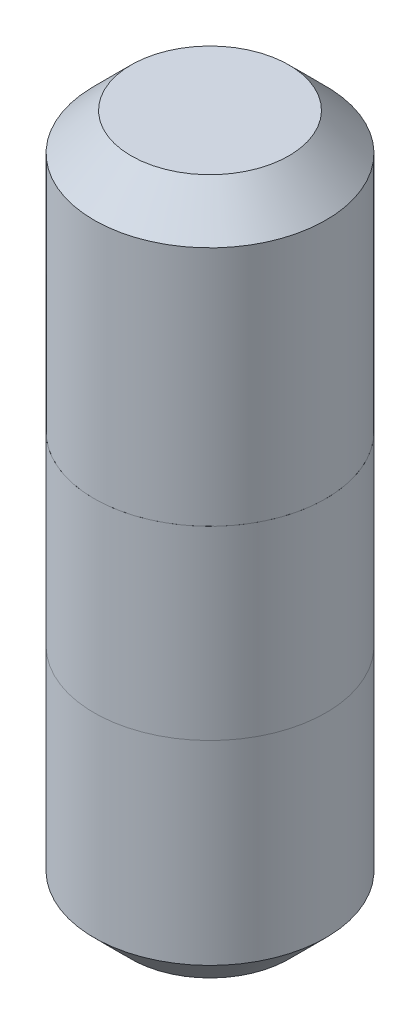
ISO-10303-21;
HEADER;
FILE_DESCRIPTION(('STEP AP214'),'2;1');
FILE_NAME('part.step','',(''),(''),'','','');
FILE_SCHEMA(('AUTOMOTIVE_DESIGN { 1 0 10303 214 1 1 1 1 }'));
ENDSEC;
DATA;
#1=APPLICATION_CONTEXT('core data for automotive mechanical design processes');
#2=APPLICATION_PROTOCOL_DEFINITION('international standard','automotive_design',2000,#1);
#3=PRODUCT_CONTEXT('',#1,'mechanical');
#4=PRODUCT('Part','Part','',(#3));
#5=PRODUCT_RELATED_PRODUCT_CATEGORY('part','',(#4));
#6=PRODUCT_DEFINITION_FORMATION('','',#4);
#7=PRODUCT_DEFINITION_CONTEXT('part definition',#1,'design');
#8=PRODUCT_DEFINITION('design','',#6,#7);
#9=PRODUCT_DEFINITION_SHAPE('','',#8);
#10=(LENGTH_UNIT() NAMED_UNIT(*) SI_UNIT(.MILLI.,.METRE.));
#11=(NAMED_UNIT(*) PLANE_ANGLE_UNIT() SI_UNIT($,.RADIAN.));
#12=(NAMED_UNIT(*) SI_UNIT($,.STERADIAN.) SOLID_ANGLE_UNIT());
#13=UNCERTAINTY_MEASURE_WITH_UNIT(LENGTH_MEASURE(1.E-05),#10,'distance_accuracy_value','');
#14=(GEOMETRIC_REPRESENTATION_CONTEXT(3) GLOBAL_UNCERTAINTY_ASSIGNED_CONTEXT((#13)) GLOBAL_UNIT_ASSIGNED_CONTEXT((#10,
#11,#12)) REPRESENTATION_CONTEXT('',''));
#15=CARTESIAN_POINT('',(0.,0.,0.));
#16=DIRECTION('',(0.,0.,1.));
#17=DIRECTION('',(1.,0.,0.));
#18=AXIS2_PLACEMENT_3D('',#15,#16,#17);
#19=CARTESIAN_POINT('',(0.,-18.,0.));
#20=DIRECTION('',(0.,1.,0.));
#21=DIRECTION('',(0.,0.,1.));
#22=AXIS2_PLACEMENT_3D('',#19,#20,#21);
#23=CYLINDRICAL_SURFACE('',#22,5.);
#24=CARTESIAN_POINT('',(0.,-16.4,0.));
#25=DIRECTION('',(0.,-1.,0.));
#26=DIRECTION('',(0.,0.,-1.));
#27=AXIS2_PLACEMENT_3D('',#24,#25,#26);
#28=CIRCLE('',#27,5.);
#29=CARTESIAN_POINT('',(0.,-16.4,-5.));
#30=VERTEX_POINT('',#29);
#31=EDGE_CURVE('E11',#30,#30,#28,.F.);
#32=ORIENTED_EDGE('',*,*,#31,.T.);
#33=EDGE_LOOP('',(#32));
#34=FACE_BOUND('',#33,.T.);
#35=CARTESIAN_POINT('',(0.,-8.,0.));
#36=DIRECTION('',(0.,-1.,0.));
#37=DIRECTION('',(0.,0.,-1.));
#38=AXIS2_PLACEMENT_3D('',#35,#36,#37);
#39=CIRCLE('',#38,5.);
#40=CARTESIAN_POINT('',(0.,-8.,-5.));
#41=VERTEX_POINT('',#40);
#42=EDGE_CURVE('E56',#41,#41,#39,.T.);
#43=ORIENTED_EDGE('',*,*,#42,.T.);
#44=EDGE_LOOP('',(#43));
#45=FACE_BOUND('',#44,.T.);
#46=ADVANCED_FACE('F45',(#34,#45),#23,.T.);
#47=CARTESIAN_POINT('',(0.,-18.,0.));
#48=DIRECTION('',(0.,-1.,0.));
#49=DIRECTION('',(0.,0.,-1.));
#50=AXIS2_PLACEMENT_3D('',#47,#48,#49);
#51=PLANE('',#50);
#52=CARTESIAN_POINT('',(0.,-18.,0.));
#53=DIRECTION('',(0.,-1.,0.));
#54=DIRECTION('',(0.,0.,-1.));
#55=AXIS2_PLACEMENT_3D('',#52,#53,#54);
#56=CIRCLE('',#55,3.4);
#57=CARTESIAN_POINT('',(0.,-18.,-3.4));
#58=VERTEX_POINT('',#57);
#59=EDGE_CURVE('E52',#58,#58,#56,.T.);
#60=ORIENTED_EDGE('',*,*,#59,.T.);
#61=EDGE_LOOP('',(#60));
#62=FACE_BOUND('',#61,.T.);
#63=ADVANCED_FACE('F66',(#62),#51,.T.);
#64=CARTESIAN_POINT('',(0.,-8.,0.));
#65=DIRECTION('',(0.,-1.,0.));
#66=DIRECTION('',(0.,0.,-1.));
#67=AXIS2_PLACEMENT_3D('',#64,#65,#66);
#68=PLANE('',#67);
#69=ORIENTED_EDGE('',*,*,#42,.F.);
#70=EDGE_LOOP('',(#69));
#71=FACE_BOUND('',#70,.T.);
#72=ADVANCED_FACE('F64',(#71),#68,.F.);
#73=CARTESIAN_POINT('',(0.,-18.,0.));
#74=DIRECTION('',(0.,1.,0.));
#75=DIRECTION('',(0.,0.,1.));
#76=AXIS2_PLACEMENT_3D('',#73,#74,#75);
#77=CONICAL_SURFACE('',#76,3.4,0.785398163397447);
#78=ORIENTED_EDGE('',*,*,#31,.F.);
#79=EDGE_LOOP('',(#78));
#80=FACE_BOUND('',#79,.T.);
#81=ORIENTED_EDGE('',*,*,#59,.F.);
#82=EDGE_LOOP('',(#81));
#83=FACE_BOUND('',#82,.T.);
#84=ADVANCED_FACE('F47',(#80,#83),#77,.T.);
#85=CLOSED_SHELL('',(#46,#63,#72,#84));
#86=MANIFOLD_SOLID_BREP('B2',#85);
#87=CARTESIAN_POINT('',(0.,-8.,0.));
#88=DIRECTION('',(0.,1.,0.));
#89=DIRECTION('',(0.,0.,1.));
#90=AXIS2_PLACEMENT_3D('',#87,#88,#89);
#91=CYLINDRICAL_SURFACE('',#90,5.);
#92=CARTESIAN_POINT('',(0.,-8.,0.));
#93=DIRECTION('',(0.,-1.,0.));
#94=DIRECTION('',(0.,0.,-1.));
#95=AXIS2_PLACEMENT_3D('',#92,#93,#94);
#96=CIRCLE('',#95,5.);
#97=CARTESIAN_POINT('',(0.,-8.,-5.));
#98=VERTEX_POINT('',#97);
#99=EDGE_CURVE('E44',#98,#98,#96,.T.);
#100=ORIENTED_EDGE('',*,*,#99,.F.);
#101=EDGE_LOOP('',(#100));
#102=FACE_BOUND('',#101,.T.);
#103=CARTESIAN_POINT('',(0.,0.,0.));
#104=DIRECTION('',(0.,-1.,0.));
#105=DIRECTION('',(0.,0.,-1.));
#106=AXIS2_PLACEMENT_3D('',#103,#104,#105);
#107=CIRCLE('',#106,5.);
#108=CARTESIAN_POINT('',(0.,0.,-5.));
#109=VERTEX_POINT('',#108);
#110=EDGE_CURVE('E127',#109,#109,#107,.T.);
#111=ORIENTED_EDGE('',*,*,#110,.T.);
#112=EDGE_LOOP('',(#111));
#113=FACE_BOUND('',#112,.T.);
#114=ADVANCED_FACE('F124',(#102,#113),#91,.T.);
#115=CARTESIAN_POINT('',(0.,-8.,0.));
#116=DIRECTION('',(0.,-1.,0.));
#117=DIRECTION('',(0.,0.,-1.));
#118=AXIS2_PLACEMENT_3D('',#115,#116,#117);
#119=PLANE('',#118);
#120=ORIENTED_EDGE('',*,*,#99,.T.);
#121=EDGE_LOOP('',(#120));
#122=FACE_BOUND('',#121,.T.);
#123=ADVANCED_FACE('F139',(#122),#119,.T.);
#124=CARTESIAN_POINT('',(0.,0.,0.));
#125=DIRECTION('',(0.,-1.,0.));
#126=DIRECTION('',(0.,0.,-1.));
#127=AXIS2_PLACEMENT_3D('',#124,#125,#126);
#128=PLANE('',#127);
#129=ORIENTED_EDGE('',*,*,#110,.F.);
#130=EDGE_LOOP('',(#129));
#131=FACE_BOUND('',#130,.T.);
#132=ADVANCED_FACE('F137',(#131),#128,.F.);
#133=CLOSED_SHELL('',(#114,#123,#132));
#134=MANIFOLD_SOLID_BREP('B6',#133);
#135=CARTESIAN_POINT('',(0.,12.,0.));
#136=DIRECTION('',(0.,-1.,0.));
#137=DIRECTION('',(0.,0.,-1.));
#138=AXIS2_PLACEMENT_3D('',#135,#136,#137);
#139=CYLINDRICAL_SURFACE('',#138,5.);
#140=CARTESIAN_POINT('',(0.,10.4,0.));
#141=DIRECTION('',(0.,1.,0.));
#142=DIRECTION('',(0.,0.,1.));
#143=AXIS2_PLACEMENT_3D('',#140,#141,#142);
#144=CIRCLE('',#143,5.);
#145=CARTESIAN_POINT('',(0.,10.4,5.));
#146=VERTEX_POINT('',#145);
#147=EDGE_CURVE('E123',#146,#146,#144,.F.);
#148=ORIENTED_EDGE('',*,*,#147,.T.);
#149=EDGE_LOOP('',(#148));
#150=FACE_BOUND('',#149,.T.);
#151=CARTESIAN_POINT('',(0.,0.,0.));
#152=DIRECTION('',(0.,1.,0.));
#153=DIRECTION('',(0.,0.,1.));
#154=AXIS2_PLACEMENT_3D('',#151,#152,#153);
#155=CIRCLE('',#154,5.);
#156=CARTESIAN_POINT('',(0.,0.,5.));
#157=VERTEX_POINT('',#156);
#158=EDGE_CURVE('E175',#157,#157,#155,.T.);
#159=ORIENTED_EDGE('',*,*,#158,.T.);
#160=EDGE_LOOP('',(#159));
#161=FACE_BOUND('',#160,.T.);
#162=ADVANCED_FACE('F164',(#150,#161),#139,.T.);
#163=CARTESIAN_POINT('',(0.,12.,0.));
#164=DIRECTION('',(0.,1.,0.));
#165=DIRECTION('',(0.,0.,1.));
#166=AXIS2_PLACEMENT_3D('',#163,#164,#165);
#167=PLANE('',#166);
#168=CARTESIAN_POINT('',(0.,12.,0.));
#169=DIRECTION('',(0.,1.,0.));
#170=DIRECTION('',(0.,0.,1.));
#171=AXIS2_PLACEMENT_3D('',#168,#169,#170);
#172=CIRCLE('',#171,3.40000000000001);
#173=CARTESIAN_POINT('',(0.,12.,3.40000000000001));
#174=VERTEX_POINT('',#173);
#175=EDGE_CURVE('E171',#174,#174,#172,.T.);
#176=ORIENTED_EDGE('',*,*,#175,.T.);
#177=EDGE_LOOP('',(#176));
#178=FACE_BOUND('',#177,.T.);
#179=ADVANCED_FACE('F185',(#178),#167,.T.);
#180=CARTESIAN_POINT('',(0.,0.,0.));
#181=DIRECTION('',(0.,1.,0.));
#182=DIRECTION('',(0.,0.,1.));
#183=AXIS2_PLACEMENT_3D('',#180,#181,#182);
#184=PLANE('',#183);
#185=ORIENTED_EDGE('',*,*,#158,.F.);
#186=EDGE_LOOP('',(#185));
#187=FACE_BOUND('',#186,.T.);
#188=ADVANCED_FACE('F183',(#187),#184,.F.);
#189=CARTESIAN_POINT('',(0.,12.,0.));
#190=DIRECTION('',(0.,-1.,0.));
#191=DIRECTION('',(0.,0.,-1.));
#192=AXIS2_PLACEMENT_3D('',#189,#190,#191);
#193=CONICAL_SURFACE('',#192,3.40000000000001,0.785398163397446);
#194=ORIENTED_EDGE('',*,*,#147,.F.);
#195=EDGE_LOOP('',(#194));
#196=FACE_BOUND('',#195,.T.);
#197=ORIENTED_EDGE('',*,*,#175,.F.);
#198=EDGE_LOOP('',(#197));
#199=FACE_BOUND('',#198,.T.);
#200=ADVANCED_FACE('F166',(#196,#199),#193,.T.);
#201=CLOSED_SHELL('',(#162,#179,#188,#200));
#202=MANIFOLD_SOLID_BREP('B39',#201);
#203=ADVANCED_BREP_SHAPE_REPRESENTATION('',(#18,#86,#134,#202),#14);
#204=SHAPE_DEFINITION_REPRESENTATION(#9,#203);
ENDSEC;
END-ISO-10303-21;
